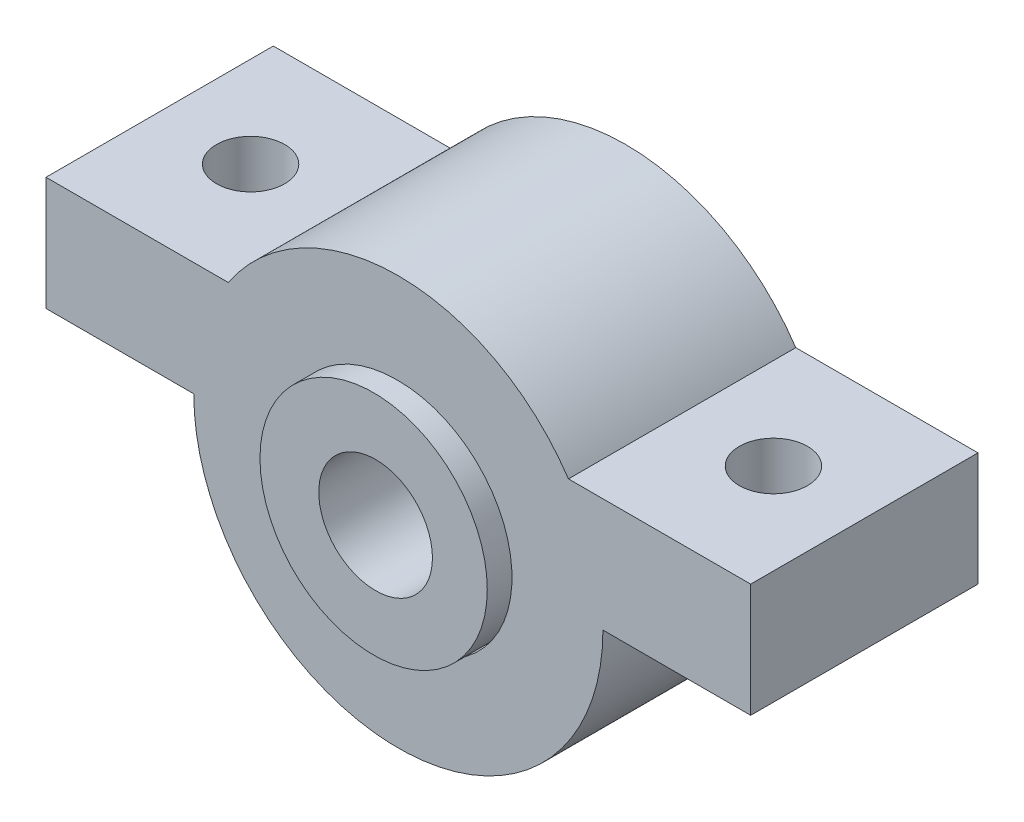
ISO-10303-21;
HEADER;
FILE_DESCRIPTION(('STEP AP214'),'2;1');
FILE_NAME('part.step','',(''),(''),'','','');
FILE_SCHEMA(('AUTOMOTIVE_DESIGN { 1 0 10303 214 1 1 1 1 }'));
ENDSEC;
DATA;
#1=APPLICATION_CONTEXT('core data for automotive mechanical design processes');
#2=APPLICATION_PROTOCOL_DEFINITION('international standard','automotive_design',2000,#1);
#3=PRODUCT_CONTEXT('',#1,'mechanical');
#4=PRODUCT('Part','Part','',(#3));
#5=PRODUCT_RELATED_PRODUCT_CATEGORY('part','',(#4));
#6=PRODUCT_DEFINITION_FORMATION('','',#4);
#7=PRODUCT_DEFINITION_CONTEXT('part definition',#1,'design');
#8=PRODUCT_DEFINITION('design','',#6,#7);
#9=PRODUCT_DEFINITION_SHAPE('','',#8);
#10=(LENGTH_UNIT() NAMED_UNIT(*) SI_UNIT(.MILLI.,.METRE.));
#11=(NAMED_UNIT(*) PLANE_ANGLE_UNIT() SI_UNIT($,.RADIAN.));
#12=(NAMED_UNIT(*) SI_UNIT($,.STERADIAN.) SOLID_ANGLE_UNIT());
#13=UNCERTAINTY_MEASURE_WITH_UNIT(LENGTH_MEASURE(1.E-05),#10,'distance_accuracy_value','');
#14=(GEOMETRIC_REPRESENTATION_CONTEXT(3) GLOBAL_UNCERTAINTY_ASSIGNED_CONTEXT((#13)) GLOBAL_UNIT_ASSIGNED_CONTEXT((#10,
#11,#12)) REPRESENTATION_CONTEXT('',''));
#15=CARTESIAN_POINT('',(0.,0.,0.));
#16=DIRECTION('',(0.,0.,1.));
#17=DIRECTION('',(1.,0.,0.));
#18=AXIS2_PLACEMENT_3D('',#15,#16,#17);
#19=CARTESIAN_POINT('',(-0.0875041941135685,0.,-2.));
#20=DIRECTION('',(0.,0.,1.));
#21=DIRECTION('',(1.,0.,0.));
#22=AXIS2_PLACEMENT_3D('',#19,#20,#21);
#23=CYLINDRICAL_SURFACE('',#22,5.);
#24=CARTESIAN_POINT('',(-0.0875041941135685,0.,-0.999999999999999));
#25=DIRECTION('',(0.,0.,-1.));
#26=DIRECTION('',(-1.,0.,0.));
#27=AXIS2_PLACEMENT_3D('',#24,#25,#26);
#28=CIRCLE('',#27,5.);
#29=CARTESIAN_POINT('',(-5.08750419411357,0.,-0.999999999999999));
#30=VERTEX_POINT('',#29);
#31=EDGE_CURVE('E323',#30,#30,#28,.F.);
#32=ORIENTED_EDGE('',*,*,#31,.T.);
#33=EDGE_LOOP('',(#32));
#34=FACE_BOUND('',#33,.T.);
#35=CARTESIAN_POINT('',(-0.0875041941135685,0.,0.));
#36=DIRECTION('',(0.,0.,1.));
#37=DIRECTION('',(1.,0.,0.));
#38=AXIS2_PLACEMENT_3D('',#35,#36,#37);
#39=CIRCLE('',#38,5.);
#40=CARTESIAN_POINT('',(-0.0437520970567842,4.99980857173584,0.));
#41=VERTEX_POINT('',#40);
#42=CARTESIAN_POINT('',(-0.0437520970567842,-4.99980857173584,0.));
#43=VERTEX_POINT('',#42);
#44=EDGE_CURVE('E249',#41,#43,#39,.T.);
#45=ORIENTED_EDGE('',*,*,#44,.F.);
#46=DIRECTION('',(0.,0.,1.));
#47=VECTOR('',#46,1.);
#48=CARTESIAN_POINT('',(-0.0437520970567842,4.99980857173584,5.));
#49=LINE('',#48,#47);
#50=CARTESIAN_POINT('',(-0.0437520970567842,4.99980857173584,10.));
#51=VERTEX_POINT('',#50);
#52=EDGE_CURVE('E256',#41,#51,#49,.T.);
#53=ORIENTED_EDGE('',*,*,#52,.T.);
#54=CARTESIAN_POINT('',(-0.0875041941135685,0.,10.));
#55=DIRECTION('',(0.,0.,1.));
#56=DIRECTION('',(1.,0.,0.));
#57=AXIS2_PLACEMENT_3D('',#54,#55,#56);
#58=CIRCLE('',#57,5.);
#59=CARTESIAN_POINT('',(-0.0437520970567842,-4.99980857173584,10.));
#60=VERTEX_POINT('',#59);
#61=EDGE_CURVE('E12',#51,#60,#58,.T.);
#62=ORIENTED_EDGE('',*,*,#61,.T.);
#63=DIRECTION('',(0.,0.,1.));
#64=VECTOR('',#63,1.);
#65=CARTESIAN_POINT('',(-0.0437520970567842,-4.99980857173584,5.));
#66=LINE('',#65,#64);
#67=EDGE_CURVE('E319',#60,#43,#66,.F.);
#68=ORIENTED_EDGE('',*,*,#67,.T.);
#69=EDGE_LOOP('',(#45,#53,#62,#68));
#70=FACE_BOUND('',#69,.T.);
#71=CARTESIAN_POINT('',(-0.0875041941135685,0.,11.));
#72=DIRECTION('',(0.,0.,1.));
#73=DIRECTION('',(1.,0.,0.));
#74=AXIS2_PLACEMENT_3D('',#71,#72,#73);
#75=CIRCLE('',#74,5.);
#76=CARTESIAN_POINT('',(4.91249580588643,0.,11.));
#77=VERTEX_POINT('',#76);
#78=EDGE_CURVE('E388',#77,#77,#75,.F.);
#79=ORIENTED_EDGE('',*,*,#78,.T.);
#80=EDGE_LOOP('',(#79));
#81=FACE_BOUND('',#80,.T.);
#82=ADVANCED_FACE('F233',(#34,#70,#81),#23,.T.);
#83=CARTESIAN_POINT('',(0.,0.,-2.));
#84=DIRECTION('',(0.,0.,1.));
#85=DIRECTION('',(1.,0.,0.));
#86=AXIS2_PLACEMENT_3D('',#83,#84,#85);
#87=CYLINDRICAL_SURFACE('',#86,2.5);
#88=CARTESIAN_POINT('',(0.,0.,-0.999999999999999));
#89=DIRECTION('',(0.,0.,-1.));
#90=DIRECTION('',(-1.,0.,0.));
#91=AXIS2_PLACEMENT_3D('',#88,#89,#90);
#92=CIRCLE('',#91,2.5);
#93=CARTESIAN_POINT('',(-2.5,0.,-0.999999999999999));
#94=VERTEX_POINT('',#93);
#95=EDGE_CURVE('E386',#94,#94,#92,.F.);
#96=ORIENTED_EDGE('',*,*,#95,.F.);
#97=EDGE_LOOP('',(#96));
#98=FACE_BOUND('',#97,.T.);
#99=CARTESIAN_POINT('',(0.,0.,11.));
#100=DIRECTION('',(0.,0.,1.));
#101=DIRECTION('',(1.,0.,0.));
#102=AXIS2_PLACEMENT_3D('',#99,#100,#101);
#103=CIRCLE('',#102,2.5);
#104=CARTESIAN_POINT('',(2.5,0.,11.));
#105=VERTEX_POINT('',#104);
#106=EDGE_CURVE('E237',#105,#105,#103,.F.);
#107=ORIENTED_EDGE('',*,*,#106,.F.);
#108=EDGE_LOOP('',(#107));
#109=FACE_BOUND('',#108,.T.);
#110=ADVANCED_FACE('F462',(#98,#109),#87,.F.);
#111=CARTESIAN_POINT('',(0.,0.,10.));
#112=DIRECTION('',(0.,0.,-1.));
#113=DIRECTION('',(-1.,0.,0.));
#114=AXIS2_PLACEMENT_3D('',#111,#112,#113);
#115=CYLINDRICAL_SURFACE('',#114,9.);
#116=CARTESIAN_POINT('',(0.,0.,0.));
#117=DIRECTION('',(0.,0.,1.));
#118=DIRECTION('',(1.,0.,0.));
#119=AXIS2_PLACEMENT_3D('',#116,#117,#118);
#120=CIRCLE('',#119,9.);
#121=CARTESIAN_POINT('',(7.48331477354788,5.,0.));
#122=VERTEX_POINT('',#121);
#123=CARTESIAN_POINT('',(-7.48331477354788,5.,0.));
#124=VERTEX_POINT('',#123);
#125=EDGE_CURVE('E335',#122,#124,#120,.T.);
#126=ORIENTED_EDGE('',*,*,#125,.T.);
#127=DIRECTION('',(0.,0.,-1.));
#128=VECTOR('',#127,1.);
#129=CARTESIAN_POINT('',(-7.48331477354788,5.,10.));
#130=LINE('',#129,#128);
#131=CARTESIAN_POINT('',(-7.48331477354788,5.,10.));
#132=VERTEX_POINT('',#131);
#133=EDGE_CURVE('E343',#132,#124,#130,.T.);
#134=ORIENTED_EDGE('',*,*,#133,.F.);
#135=CARTESIAN_POINT('',(0.,0.,10.));
#136=DIRECTION('',(0.,0.,1.));
#137=DIRECTION('',(1.,0.,0.));
#138=AXIS2_PLACEMENT_3D('',#135,#136,#137);
#139=CIRCLE('',#138,9.);
#140=CARTESIAN_POINT('',(7.48331477354788,5.,10.));
#141=VERTEX_POINT('',#140);
#142=EDGE_CURVE('E315',#141,#132,#139,.T.);
#143=ORIENTED_EDGE('',*,*,#142,.F.);
#144=DIRECTION('',(0.,0.,-1.));
#145=VECTOR('',#144,1.);
#146=CARTESIAN_POINT('',(7.48331477354788,5.,10.));
#147=LINE('',#146,#145);
#148=EDGE_CURVE('E242',#141,#122,#147,.T.);
#149=ORIENTED_EDGE('',*,*,#148,.T.);
#150=EDGE_LOOP('',(#126,#134,#143,#149));
#151=FACE_BOUND('',#150,.T.);
#152=ADVANCED_FACE('F428',(#151),#115,.T.);
#153=CARTESIAN_POINT('',(-9.,0.,0.));
#154=VERTEX_POINT('',#153);
#155=CARTESIAN_POINT('',(9.,0.,0.));
#156=VERTEX_POINT('',#155);
#157=EDGE_CURVE('E316',#154,#156,#120,.T.);
#158=ORIENTED_EDGE('',*,*,#157,.T.);
#159=DIRECTION('',(0.,0.,-1.));
#160=VECTOR('',#159,1.);
#161=CARTESIAN_POINT('',(9.,0.,10.));
#162=LINE('',#161,#160);
#163=CARTESIAN_POINT('',(9.,0.,10.));
#164=VERTEX_POINT('',#163);
#165=EDGE_CURVE('E339',#164,#156,#162,.T.);
#166=ORIENTED_EDGE('',*,*,#165,.F.);
#167=CARTESIAN_POINT('',(-9.,0.,10.));
#168=VERTEX_POINT('',#167);
#169=EDGE_CURVE('E333',#168,#164,#139,.T.);
#170=ORIENTED_EDGE('',*,*,#169,.F.);
#171=DIRECTION('',(0.,0.,-1.));
#172=VECTOR('',#171,1.);
#173=CARTESIAN_POINT('',(-9.,0.,10.));
#174=LINE('',#173,#172);
#175=EDGE_CURVE('E341',#168,#154,#174,.T.);
#176=ORIENTED_EDGE('',*,*,#175,.T.);
#177=EDGE_LOOP('',(#158,#166,#170,#176));
#178=FACE_BOUND('',#177,.T.);
#179=ADVANCED_FACE('F442',(#178),#115,.T.);
#180=CARTESIAN_POINT('',(0.,0.,10.));
#181=DIRECTION('',(0.,0.,-1.));
#182=DIRECTION('',(-1.,0.,0.));
#183=AXIS2_PLACEMENT_3D('',#180,#181,#182);
#184=CYLINDRICAL_SURFACE('',#183,5.);
#185=ORIENTED_EDGE('',*,*,#52,.F.);
#186=CARTESIAN_POINT('',(0.,0.,0.));
#187=DIRECTION('',(0.,0.,1.));
#188=DIRECTION('',(1.,0.,0.));
#189=AXIS2_PLACEMENT_3D('',#186,#187,#188);
#190=CIRCLE('',#189,5.);
#191=EDGE_CURVE('E321',#43,#41,#190,.T.);
#192=ORIENTED_EDGE('',*,*,#191,.F.);
#193=ORIENTED_EDGE('',*,*,#67,.F.);
#194=CARTESIAN_POINT('',(0.,0.,10.));
#195=DIRECTION('',(0.,0.,1.));
#196=DIRECTION('',(1.,0.,0.));
#197=AXIS2_PLACEMENT_3D('',#194,#195,#196);
#198=CIRCLE('',#197,5.);
#199=EDGE_CURVE('E311',#60,#51,#198,.T.);
#200=ORIENTED_EDGE('',*,*,#199,.T.);
#201=EDGE_LOOP('',(#185,#192,#193,#200));
#202=FACE_BOUND('',#201,.T.);
#203=ADVANCED_FACE('F320',(#202),#184,.F.);
#204=CARTESIAN_POINT('',(0.,0.,0.));
#205=DIRECTION('',(0.,0.,1.));
#206=DIRECTION('',(1.,0.,0.));
#207=AXIS2_PLACEMENT_3D('',#204,#205,#206);
#208=PLANE('',#207);
#209=ORIENTED_EDGE('',*,*,#157,.F.);
#210=DIRECTION('',(1.,0.,0.));
#211=VECTOR('',#210,1.);
#212=CARTESIAN_POINT('',(0.,0.,0.));
#213=LINE('',#212,#211);
#214=CARTESIAN_POINT('',(-15.5,0.,0.));
#215=VERTEX_POINT('',#214);
#216=EDGE_CURVE('E371',#215,#154,#213,.T.);
#217=ORIENTED_EDGE('',*,*,#216,.F.);
#218=DIRECTION('',(0.,1.,0.));
#219=VECTOR('',#218,1.);
#220=CARTESIAN_POINT('',(-15.5,0.,0.));
#221=LINE('',#220,#219);
#222=CARTESIAN_POINT('',(-15.5,5.,0.));
#223=VERTEX_POINT('',#222);
#224=EDGE_CURVE('E380',#215,#223,#221,.T.);
#225=ORIENTED_EDGE('',*,*,#224,.T.);
#226=DIRECTION('',(1.,0.,0.));
#227=VECTOR('',#226,1.);
#228=CARTESIAN_POINT('',(0.,5.,0.));
#229=LINE('',#228,#227);
#230=EDGE_CURVE('E327',#223,#124,#229,.T.);
#231=ORIENTED_EDGE('',*,*,#230,.T.);
#232=ORIENTED_EDGE('',*,*,#125,.F.);
#233=DIRECTION('',(-1.,0.,0.));
#234=VECTOR('',#233,1.);
#235=CARTESIAN_POINT('',(0.,5.,0.));
#236=LINE('',#235,#234);
#237=CARTESIAN_POINT('',(15.5,5.,0.));
#238=VERTEX_POINT('',#237);
#239=EDGE_CURVE('E350',#238,#122,#236,.T.);
#240=ORIENTED_EDGE('',*,*,#239,.F.);
#241=DIRECTION('',(0.,1.,0.));
#242=VECTOR('',#241,1.);
#243=CARTESIAN_POINT('',(15.5,0.,0.));
#244=LINE('',#243,#242);
#245=CARTESIAN_POINT('',(15.5,0.,0.));
#246=VERTEX_POINT('',#245);
#247=EDGE_CURVE('E359',#246,#238,#244,.T.);
#248=ORIENTED_EDGE('',*,*,#247,.F.);
#249=DIRECTION('',(-1.,0.,0.));
#250=VECTOR('',#249,1.);
#251=CARTESIAN_POINT('',(0.,0.,0.));
#252=LINE('',#251,#250);
#253=EDGE_CURVE('E356',#246,#156,#252,.T.);
#254=ORIENTED_EDGE('',*,*,#253,.T.);
#255=EDGE_LOOP('',(#209,#217,#225,#231,#232,#240,#248,#254));
#256=FACE_BOUND('',#255,.T.);
#257=ORIENTED_EDGE('',*,*,#191,.T.);
#258=ORIENTED_EDGE('',*,*,#44,.T.);
#259=EDGE_LOOP('',(#257,#258));
#260=FACE_BOUND('',#259,.T.);
#261=ADVANCED_FACE('F425',(#256,#260),#208,.F.);
#262=CARTESIAN_POINT('',(0.,0.,10.));
#263=DIRECTION('',(0.,0.,1.));
#264=DIRECTION('',(1.,0.,0.));
#265=AXIS2_PLACEMENT_3D('',#262,#263,#264);
#266=PLANE('',#265);
#267=ORIENTED_EDGE('',*,*,#61,.F.);
#268=ORIENTED_EDGE('',*,*,#199,.F.);
#269=EDGE_LOOP('',(#267,#268));
#270=FACE_BOUND('',#269,.T.);
#271=ORIENTED_EDGE('',*,*,#142,.T.);
#272=DIRECTION('',(1.,0.,0.));
#273=VECTOR('',#272,1.);
#274=CARTESIAN_POINT('',(0.,5.,10.));
#275=LINE('',#274,#273);
#276=CARTESIAN_POINT('',(-15.5,5.,10.));
#277=VERTEX_POINT('',#276);
#278=EDGE_CURVE('E367',#277,#132,#275,.T.);
#279=ORIENTED_EDGE('',*,*,#278,.F.);
#280=DIRECTION('',(0.,1.,0.));
#281=VECTOR('',#280,1.);
#282=CARTESIAN_POINT('',(-15.5,0.,10.));
#283=LINE('',#282,#281);
#284=CARTESIAN_POINT('',(-15.5,0.,10.));
#285=VERTEX_POINT('',#284);
#286=EDGE_CURVE('E370',#285,#277,#283,.T.);
#287=ORIENTED_EDGE('',*,*,#286,.F.);
#288=DIRECTION('',(1.,0.,0.));
#289=VECTOR('',#288,1.);
#290=CARTESIAN_POINT('',(0.,0.,10.));
#291=LINE('',#290,#289);
#292=EDGE_CURVE('E374',#285,#168,#291,.T.);
#293=ORIENTED_EDGE('',*,*,#292,.T.);
#294=ORIENTED_EDGE('',*,*,#169,.T.);
#295=DIRECTION('',(-1.,0.,0.));
#296=VECTOR('',#295,1.);
#297=CARTESIAN_POINT('',(0.,0.,10.));
#298=LINE('',#297,#296);
#299=CARTESIAN_POINT('',(15.5,0.,10.));
#300=VERTEX_POINT('',#299);
#301=EDGE_CURVE('E346',#300,#164,#298,.T.);
#302=ORIENTED_EDGE('',*,*,#301,.F.);
#303=DIRECTION('',(0.,1.,0.));
#304=VECTOR('',#303,1.);
#305=CARTESIAN_POINT('',(15.5,0.,10.));
#306=LINE('',#305,#304);
#307=CARTESIAN_POINT('',(15.5,5.,10.));
#308=VERTEX_POINT('',#307);
#309=EDGE_CURVE('E349',#300,#308,#306,.T.);
#310=ORIENTED_EDGE('',*,*,#309,.T.);
#311=DIRECTION('',(-1.,0.,0.));
#312=VECTOR('',#311,1.);
#313=CARTESIAN_POINT('',(0.,5.,10.));
#314=LINE('',#313,#312);
#315=EDGE_CURVE('E352',#308,#141,#314,.T.);
#316=ORIENTED_EDGE('',*,*,#315,.T.);
#317=EDGE_LOOP('',(#271,#279,#287,#293,#294,#302,#310,#316));
#318=FACE_BOUND('',#317,.T.);
#319=ADVANCED_FACE('F313',(#270,#318),#266,.T.);
#320=CARTESIAN_POINT('',(-15.5,0.,10.));
#321=DIRECTION('',(-1.,0.,0.));
#322=DIRECTION('',(0.,0.,1.));
#323=AXIS2_PLACEMENT_3D('',#320,#321,#322);
#324=PLANE('',#323);
#325=ORIENTED_EDGE('',*,*,#224,.F.);
#326=DIRECTION('',(0.,0.,-1.));
#327=VECTOR('',#326,1.);
#328=CARTESIAN_POINT('',(-15.5,0.,10.));
#329=LINE('',#328,#327);
#330=EDGE_CURVE('E377',#285,#215,#329,.T.);
#331=ORIENTED_EDGE('',*,*,#330,.F.);
#332=ORIENTED_EDGE('',*,*,#286,.T.);
#333=DIRECTION('',(0.,0.,-1.));
#334=VECTOR('',#333,1.);
#335=CARTESIAN_POINT('',(-15.5,5.,10.));
#336=LINE('',#335,#334);
#337=EDGE_CURVE('E360',#277,#223,#336,.T.);
#338=ORIENTED_EDGE('',*,*,#337,.T.);
#339=EDGE_LOOP('',(#325,#331,#332,#338));
#340=FACE_BOUND('',#339,.T.);
#341=ADVANCED_FACE('F447',(#340),#324,.T.);
#342=CARTESIAN_POINT('',(0.,0.,10.));
#343=DIRECTION('',(0.,1.,0.));
#344=DIRECTION('',(0.,0.,1.));
#345=AXIS2_PLACEMENT_3D('',#342,#343,#344);
#346=PLANE('',#345);
#347=CARTESIAN_POINT('',(-11.5,0.,5.));
#348=DIRECTION('',(0.,1.,0.));
#349=DIRECTION('',(0.,0.,1.));
#350=AXIS2_PLACEMENT_3D('',#347,#348,#349);
#351=CIRCLE('',#350,1.5);
#352=CARTESIAN_POINT('',(-11.5,0.,6.5));
#353=VERTEX_POINT('',#352);
#354=EDGE_CURVE('E396',#353,#353,#351,.T.);
#355=ORIENTED_EDGE('',*,*,#354,.T.);
#356=EDGE_LOOP('',(#355));
#357=FACE_BOUND('',#356,.T.);
#358=ORIENTED_EDGE('',*,*,#216,.T.);
#359=ORIENTED_EDGE('',*,*,#175,.F.);
#360=ORIENTED_EDGE('',*,*,#292,.F.);
#361=ORIENTED_EDGE('',*,*,#330,.T.);
#362=EDGE_LOOP('',(#358,#359,#360,#361));
#363=FACE_BOUND('',#362,.T.);
#364=ADVANCED_FACE('F451',(#357,#363),#346,.F.);
#365=CARTESIAN_POINT('',(0.,5.,10.));
#366=DIRECTION('',(0.,1.,0.));
#367=DIRECTION('',(0.,0.,1.));
#368=AXIS2_PLACEMENT_3D('',#365,#366,#367);
#369=PLANE('',#368);
#370=CARTESIAN_POINT('',(-11.5,5.,5.));
#371=DIRECTION('',(0.,1.,0.));
#372=DIRECTION('',(0.,0.,1.));
#373=AXIS2_PLACEMENT_3D('',#370,#371,#372);
#374=CIRCLE('',#373,1.5);
#375=CARTESIAN_POINT('',(-11.5,5.,6.5));
#376=VERTEX_POINT('',#375);
#377=EDGE_CURVE('E404',#376,#376,#374,.T.);
#378=ORIENTED_EDGE('',*,*,#377,.F.);
#379=EDGE_LOOP('',(#378));
#380=FACE_BOUND('',#379,.T.);
#381=ORIENTED_EDGE('',*,*,#230,.F.);
#382=ORIENTED_EDGE('',*,*,#337,.F.);
#383=ORIENTED_EDGE('',*,*,#278,.T.);
#384=ORIENTED_EDGE('',*,*,#133,.T.);
#385=EDGE_LOOP('',(#381,#382,#383,#384));
#386=FACE_BOUND('',#385,.T.);
#387=ADVANCED_FACE('F235',(#380,#386),#369,.T.);
#388=CARTESIAN_POINT('',(15.5,0.,10.));
#389=DIRECTION('',(-1.,0.,0.));
#390=DIRECTION('',(0.,0.,1.));
#391=AXIS2_PLACEMENT_3D('',#388,#389,#390);
#392=PLANE('',#391);
#393=ORIENTED_EDGE('',*,*,#247,.T.);
#394=DIRECTION('',(0.,0.,-1.));
#395=VECTOR('',#394,1.);
#396=CARTESIAN_POINT('',(15.5,5.,10.));
#397=LINE('',#396,#395);
#398=EDGE_CURVE('E355',#308,#238,#397,.T.);
#399=ORIENTED_EDGE('',*,*,#398,.F.);
#400=ORIENTED_EDGE('',*,*,#309,.F.);
#401=DIRECTION('',(0.,0.,-1.));
#402=VECTOR('',#401,1.);
#403=CARTESIAN_POINT('',(15.5,0.,10.));
#404=LINE('',#403,#402);
#405=EDGE_CURVE('E336',#300,#246,#404,.T.);
#406=ORIENTED_EDGE('',*,*,#405,.T.);
#407=EDGE_LOOP('',(#393,#399,#400,#406));
#408=FACE_BOUND('',#407,.T.);
#409=ADVANCED_FACE('F436',(#408),#392,.F.);
#410=CARTESIAN_POINT('',(0.,0.,10.));
#411=DIRECTION('',(0.,-1.,0.));
#412=DIRECTION('',(1.,0.,0.));
#413=AXIS2_PLACEMENT_3D('',#410,#411,#412);
#414=PLANE('',#413);
#415=CARTESIAN_POINT('',(11.5,0.,5.));
#416=DIRECTION('',(0.,-1.,0.));
#417=DIRECTION('',(1.,0.,0.));
#418=AXIS2_PLACEMENT_3D('',#415,#416,#417);
#419=CIRCLE('',#418,1.5);
#420=CARTESIAN_POINT('',(13.,0.,5.));
#421=VERTEX_POINT('',#420);
#422=EDGE_CURVE('E400',#421,#421,#419,.T.);
#423=ORIENTED_EDGE('',*,*,#422,.F.);
#424=EDGE_LOOP('',(#423));
#425=FACE_BOUND('',#424,.T.);
#426=ORIENTED_EDGE('',*,*,#253,.F.);
#427=ORIENTED_EDGE('',*,*,#405,.F.);
#428=ORIENTED_EDGE('',*,*,#301,.T.);
#429=ORIENTED_EDGE('',*,*,#165,.T.);
#430=EDGE_LOOP('',(#426,#427,#428,#429));
#431=FACE_BOUND('',#430,.T.);
#432=ADVANCED_FACE('F416',(#425,#431),#414,.T.);
#433=CARTESIAN_POINT('',(0.,5.,10.));
#434=DIRECTION('',(0.,-1.,0.));
#435=DIRECTION('',(0.,0.,-1.));
#436=AXIS2_PLACEMENT_3D('',#433,#434,#435);
#437=PLANE('',#436);
#438=CARTESIAN_POINT('',(11.5,5.,5.));
#439=DIRECTION('',(0.,1.,0.));
#440=DIRECTION('',(0.,0.,1.));
#441=AXIS2_PLACEMENT_3D('',#438,#439,#440);
#442=CIRCLE('',#441,1.5);
#443=CARTESIAN_POINT('',(11.5,5.,6.5));
#444=VERTEX_POINT('',#443);
#445=EDGE_CURVE('E403',#444,#444,#442,.T.);
#446=ORIENTED_EDGE('',*,*,#445,.F.);
#447=EDGE_LOOP('',(#446));
#448=FACE_BOUND('',#447,.T.);
#449=ORIENTED_EDGE('',*,*,#239,.T.);
#450=ORIENTED_EDGE('',*,*,#148,.F.);
#451=ORIENTED_EDGE('',*,*,#315,.F.);
#452=ORIENTED_EDGE('',*,*,#398,.T.);
#453=EDGE_LOOP('',(#449,#450,#451,#452));
#454=FACE_BOUND('',#453,.T.);
#455=ADVANCED_FACE('F412',(#448,#454),#437,.F.);
#456=CARTESIAN_POINT('',(-0.0875041941135685,0.,-0.999999999999999));
#457=DIRECTION('',(0.,0.,-1.));
#458=DIRECTION('',(-1.,0.,0.));
#459=AXIS2_PLACEMENT_3D('',#456,#457,#458);
#460=PLANE('',#459);
#461=ORIENTED_EDGE('',*,*,#31,.F.);
#462=EDGE_LOOP('',(#461));
#463=FACE_BOUND('',#462,.T.);
#464=ORIENTED_EDGE('',*,*,#95,.T.);
#465=EDGE_LOOP('',(#464));
#466=FACE_BOUND('',#465,.T.);
#467=ADVANCED_FACE('F415',(#463,#466),#460,.T.);
#468=CARTESIAN_POINT('',(0.,0.,11.));
#469=DIRECTION('',(0.,0.,1.));
#470=DIRECTION('',(1.,0.,0.));
#471=AXIS2_PLACEMENT_3D('',#468,#469,#470);
#472=PLANE('',#471);
#473=ORIENTED_EDGE('',*,*,#78,.F.);
#474=EDGE_LOOP('',(#473));
#475=FACE_BOUND('',#474,.T.);
#476=ORIENTED_EDGE('',*,*,#106,.T.);
#477=EDGE_LOOP('',(#476));
#478=FACE_BOUND('',#477,.T.);
#479=ADVANCED_FACE('F526',(#475,#478),#472,.T.);
#480=CARTESIAN_POINT('',(11.5,-104.,5.));
#481=DIRECTION('',(0.,1.,0.));
#482=DIRECTION('',(0.,0.,1.));
#483=AXIS2_PLACEMENT_3D('',#480,#481,#482);
#484=CYLINDRICAL_SURFACE('',#483,1.5);
#485=ORIENTED_EDGE('',*,*,#422,.T.);
#486=EDGE_LOOP('',(#485));
#487=FACE_BOUND('',#486,.T.);
#488=ORIENTED_EDGE('',*,*,#445,.T.);
#489=EDGE_LOOP('',(#488));
#490=FACE_BOUND('',#489,.T.);
#491=ADVANCED_FACE('F410',(#487,#490),#484,.F.);
#492=CARTESIAN_POINT('',(-11.5,-104.,5.));
#493=DIRECTION('',(0.,1.,0.));
#494=DIRECTION('',(0.,0.,1.));
#495=AXIS2_PLACEMENT_3D('',#492,#493,#494);
#496=CYLINDRICAL_SURFACE('',#495,1.5);
#497=ORIENTED_EDGE('',*,*,#377,.T.);
#498=EDGE_LOOP('',(#497));
#499=FACE_BOUND('',#498,.T.);
#500=ORIENTED_EDGE('',*,*,#354,.F.);
#501=EDGE_LOOP('',(#500));
#502=FACE_BOUND('',#501,.T.);
#503=ADVANCED_FACE('F545',(#499,#502),#496,.F.);
#504=CLOSED_SHELL('',(#82,#110,#152,#179,#203,#261,#319,#341,#364,#387,#409,#432,#455,#467,#479,
#491,#503));
#505=MANIFOLD_SOLID_BREP('B2',#504);
#506=ADVANCED_BREP_SHAPE_REPRESENTATION('',(#18,#505),#14);
#507=SHAPE_DEFINITION_REPRESENTATION(#9,#506);
ENDSEC;
END-ISO-10303-21;
